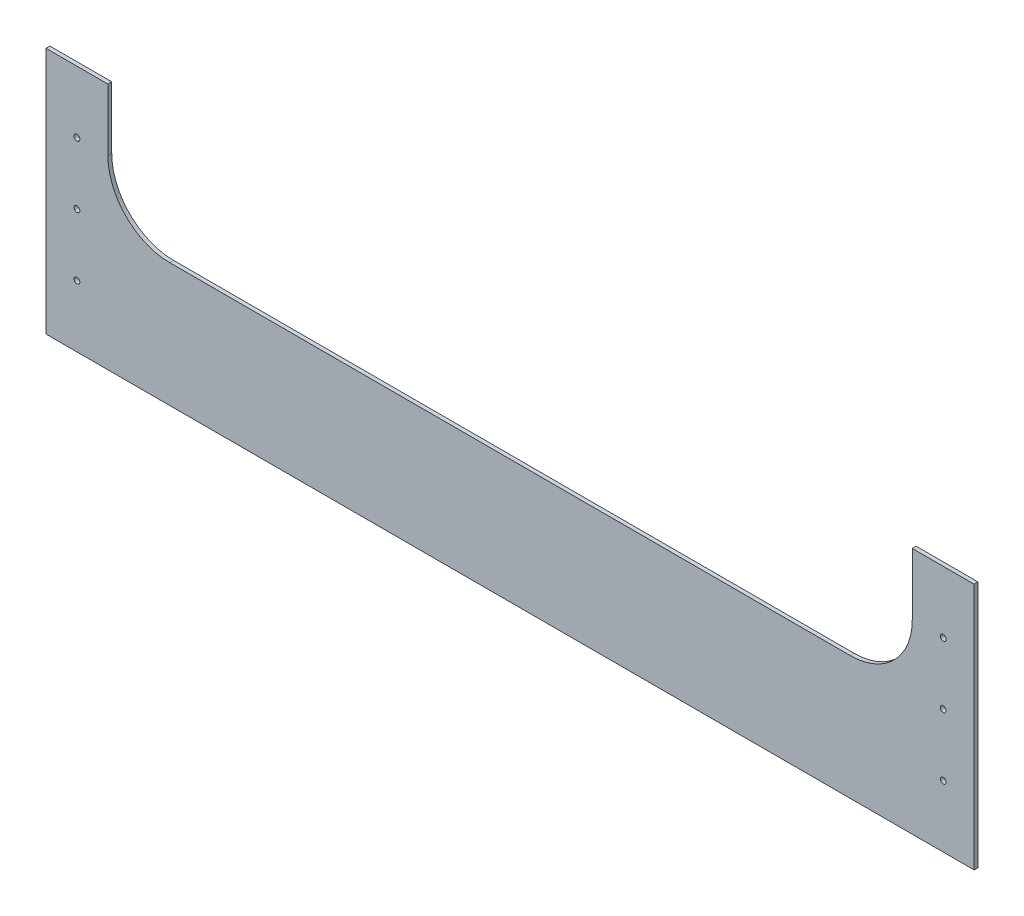
ISO-10303-21;
HEADER;
FILE_DESCRIPTION(('STEP AP214'),'2;1');
FILE_NAME('part.step','',(''),(''),'','','');
FILE_SCHEMA(('AUTOMOTIVE_DESIGN { 1 0 10303 214 1 1 1 1 }'));
ENDSEC;
DATA;
#1=APPLICATION_CONTEXT('core data for automotive mechanical design processes');
#2=APPLICATION_PROTOCOL_DEFINITION('international standard','automotive_design',2000,#1);
#3=PRODUCT_CONTEXT('',#1,'mechanical');
#4=PRODUCT('Part','Part','',(#3));
#5=PRODUCT_RELATED_PRODUCT_CATEGORY('part','',(#4));
#6=PRODUCT_DEFINITION_FORMATION('','',#4);
#7=PRODUCT_DEFINITION_CONTEXT('part definition',#1,'design');
#8=PRODUCT_DEFINITION('design','',#6,#7);
#9=PRODUCT_DEFINITION_SHAPE('','',#8);
#10=(LENGTH_UNIT() NAMED_UNIT(*) SI_UNIT(.MILLI.,.METRE.));
#11=(NAMED_UNIT(*) PLANE_ANGLE_UNIT() SI_UNIT($,.RADIAN.));
#12=(NAMED_UNIT(*) SI_UNIT($,.STERADIAN.) SOLID_ANGLE_UNIT());
#13=UNCERTAINTY_MEASURE_WITH_UNIT(LENGTH_MEASURE(1.E-05),#10,'distance_accuracy_value','');
#14=(GEOMETRIC_REPRESENTATION_CONTEXT(3) GLOBAL_UNCERTAINTY_ASSIGNED_CONTEXT((#13)) GLOBAL_UNIT_ASSIGNED_CONTEXT((#10,
#11,#12)) REPRESENTATION_CONTEXT('',''));
#15=CARTESIAN_POINT('',(0.,0.,0.));
#16=DIRECTION('',(0.,0.,1.));
#17=DIRECTION('',(1.,0.,0.));
#18=AXIS2_PLACEMENT_3D('',#15,#16,#17);
#19=CARTESIAN_POINT('',(279.4,152.4,3.175));
#20=DIRECTION('',(0.,0.,-1.));
#21=DIRECTION('',(-1.,0.,0.));
#22=AXIS2_PLACEMENT_3D('',#19,#20,#21);
#23=PLANE('',#22);
#24=DIRECTION('',(0.,1.,0.));
#25=VECTOR('',#24,1.);
#26=CARTESIAN_POINT('',(381.,0.,3.175));
#27=LINE('',#26,#25);
#28=CARTESIAN_POINT('',(381.,0.,3.175));
#29=VERTEX_POINT('',#28);
#30=CARTESIAN_POINT('',(381.,203.2,3.175));
#31=VERTEX_POINT('',#30);
#32=EDGE_CURVE('E165',#29,#31,#27,.T.);
#33=ORIENTED_EDGE('',*,*,#32,.T.);
#34=DIRECTION('',(-1.,0.,0.));
#35=VECTOR('',#34,1.);
#36=CARTESIAN_POINT('',(381.,203.2,3.175));
#37=LINE('',#36,#35);
#38=CARTESIAN_POINT('',(330.2,203.2,3.175));
#39=VERTEX_POINT('',#38);
#40=EDGE_CURVE('E103',#31,#39,#37,.T.);
#41=ORIENTED_EDGE('',*,*,#40,.T.);
#42=DIRECTION('',(0.,-1.,0.));
#43=VECTOR('',#42,1.);
#44=CARTESIAN_POINT('',(330.2,203.2,3.175));
#45=LINE('',#44,#43);
#46=CARTESIAN_POINT('',(330.2,152.4,3.175));
#47=VERTEX_POINT('',#46);
#48=EDGE_CURVE('E186',#39,#47,#45,.T.);
#49=ORIENTED_EDGE('',*,*,#48,.T.);
#50=CARTESIAN_POINT('',(279.4,152.4,3.175));
#51=DIRECTION('',(0.,0.,-1.));
#52=DIRECTION('',(-1.,0.,0.));
#53=AXIS2_PLACEMENT_3D('',#50,#51,#52);
#54=CIRCLE('',#53,50.8);
#55=CARTESIAN_POINT('',(279.4,101.6,3.175));
#56=VERTEX_POINT('',#55);
#57=EDGE_CURVE('E205',#47,#56,#54,.T.);
#58=ORIENTED_EDGE('',*,*,#57,.T.);
#59=DIRECTION('',(-1.,0.,0.));
#60=VECTOR('',#59,1.);
#61=CARTESIAN_POINT('',(279.4,101.6,3.175));
#62=LINE('',#61,#60);
#63=CARTESIAN_POINT('',(-279.4,101.6,3.175));
#64=VERTEX_POINT('',#63);
#65=EDGE_CURVE('E202',#56,#64,#62,.T.);
#66=ORIENTED_EDGE('',*,*,#65,.T.);
#67=CARTESIAN_POINT('',(-279.4,152.4,3.175));
#68=DIRECTION('',(0.,0.,-1.));
#69=DIRECTION('',(-1.,0.,0.));
#70=AXIS2_PLACEMENT_3D('',#67,#68,#69);
#71=CIRCLE('',#70,50.8);
#72=CARTESIAN_POINT('',(-330.2,152.4,3.175));
#73=VERTEX_POINT('',#72);
#74=EDGE_CURVE('E204',#64,#73,#71,.T.);
#75=ORIENTED_EDGE('',*,*,#74,.T.);
#76=DIRECTION('',(0.,1.,0.));
#77=VECTOR('',#76,1.);
#78=CARTESIAN_POINT('',(-330.2,152.4,3.175));
#79=LINE('',#78,#77);
#80=CARTESIAN_POINT('',(-330.2,203.2,3.175));
#81=VERTEX_POINT('',#80);
#82=EDGE_CURVE('E128',#73,#81,#79,.T.);
#83=ORIENTED_EDGE('',*,*,#82,.T.);
#84=DIRECTION('',(-1.,0.,0.));
#85=VECTOR('',#84,1.);
#86=CARTESIAN_POINT('',(-330.2,203.2,3.175));
#87=LINE('',#86,#85);
#88=CARTESIAN_POINT('',(-381.,203.2,3.175));
#89=VERTEX_POINT('',#88);
#90=EDGE_CURVE('E122',#81,#89,#87,.T.);
#91=ORIENTED_EDGE('',*,*,#90,.T.);
#92=DIRECTION('',(0.,-1.,0.));
#93=VECTOR('',#92,1.);
#94=CARTESIAN_POINT('',(-381.,203.2,3.175));
#95=LINE('',#94,#93);
#96=CARTESIAN_POINT('',(-381.,0.,3.175));
#97=VERTEX_POINT('',#96);
#98=EDGE_CURVE('E126',#89,#97,#95,.T.);
#99=ORIENTED_EDGE('',*,*,#98,.T.);
#100=DIRECTION('',(1.,0.,0.));
#101=VECTOR('',#100,1.);
#102=CARTESIAN_POINT('',(-381.,0.,3.175));
#103=LINE('',#102,#101);
#104=EDGE_CURVE('E54',#97,#29,#103,.T.);
#105=ORIENTED_EDGE('',*,*,#104,.T.);
#106=EDGE_LOOP('',(#33,#41,#49,#58,#66,#75,#83,#91,#99,#105));
#107=FACE_BOUND('',#106,.T.);
#108=CARTESIAN_POINT('',(-355.6,152.4,3.175));
#109=DIRECTION('',(0.,0.,1.));
#110=DIRECTION('',(1.,0.,0.));
#111=AXIS2_PLACEMENT_3D('',#108,#109,#110);
#112=CIRCLE('',#111,2.38125);
#113=CARTESIAN_POINT('',(-353.21875,152.4,3.175));
#114=VERTEX_POINT('',#113);
#115=EDGE_CURVE('E150',#114,#114,#112,.T.);
#116=ORIENTED_EDGE('',*,*,#115,.F.);
#117=EDGE_LOOP('',(#116));
#118=FACE_BOUND('',#117,.T.);
#119=CARTESIAN_POINT('',(355.6,152.4,3.175));
#120=DIRECTION('',(0.,0.,1.));
#121=DIRECTION('',(1.,0.,0.));
#122=AXIS2_PLACEMENT_3D('',#119,#120,#121);
#123=CIRCLE('',#122,2.38125);
#124=CARTESIAN_POINT('',(357.98125,152.4,3.175));
#125=VERTEX_POINT('',#124);
#126=EDGE_CURVE('E216',#125,#125,#123,.T.);
#127=ORIENTED_EDGE('',*,*,#126,.F.);
#128=EDGE_LOOP('',(#127));
#129=FACE_BOUND('',#128,.T.);
#130=CARTESIAN_POINT('',(355.6,101.6,3.175));
#131=DIRECTION('',(0.,0.,1.));
#132=DIRECTION('',(1.,0.,0.));
#133=AXIS2_PLACEMENT_3D('',#130,#131,#132);
#134=CIRCLE('',#133,2.38125);
#135=CARTESIAN_POINT('',(357.98125,101.6,3.175));
#136=VERTEX_POINT('',#135);
#137=EDGE_CURVE('E222',#136,#136,#134,.T.);
#138=ORIENTED_EDGE('',*,*,#137,.F.);
#139=EDGE_LOOP('',(#138));
#140=FACE_BOUND('',#139,.T.);
#141=CARTESIAN_POINT('',(355.6,50.8,3.175));
#142=DIRECTION('',(0.,0.,1.));
#143=DIRECTION('',(1.,0.,0.));
#144=AXIS2_PLACEMENT_3D('',#141,#142,#143);
#145=CIRCLE('',#144,2.38125);
#146=CARTESIAN_POINT('',(357.98125,50.8,3.175));
#147=VERTEX_POINT('',#146);
#148=EDGE_CURVE('E228',#147,#147,#145,.T.);
#149=ORIENTED_EDGE('',*,*,#148,.F.);
#150=EDGE_LOOP('',(#149));
#151=FACE_BOUND('',#150,.T.);
#152=CARTESIAN_POINT('',(-355.6,101.6,3.175));
#153=DIRECTION('',(0.,0.,1.));
#154=DIRECTION('',(1.,0.,0.));
#155=AXIS2_PLACEMENT_3D('',#152,#153,#154);
#156=CIRCLE('',#155,2.38125);
#157=CARTESIAN_POINT('',(-353.21875,101.6,3.175));
#158=VERTEX_POINT('',#157);
#159=EDGE_CURVE('E234',#158,#158,#156,.T.);
#160=ORIENTED_EDGE('',*,*,#159,.F.);
#161=EDGE_LOOP('',(#160));
#162=FACE_BOUND('',#161,.T.);
#163=CARTESIAN_POINT('',(-355.6,50.8,3.175));
#164=DIRECTION('',(0.,0.,1.));
#165=DIRECTION('',(1.,0.,0.));
#166=AXIS2_PLACEMENT_3D('',#163,#164,#165);
#167=CIRCLE('',#166,2.38125);
#168=CARTESIAN_POINT('',(-353.21875,50.8,3.175));
#169=VERTEX_POINT('',#168);
#170=EDGE_CURVE('E240',#169,#169,#167,.T.);
#171=ORIENTED_EDGE('',*,*,#170,.F.);
#172=EDGE_LOOP('',(#171));
#173=FACE_BOUND('',#172,.T.);
#174=ADVANCED_FACE('F37',(#107,#118,#129,#140,#151,#162,#173),#23,.F.);
#175=CARTESIAN_POINT('',(279.4,152.4,0.));
#176=DIRECTION('',(0.,0.,-1.));
#177=DIRECTION('',(-1.,0.,0.));
#178=AXIS2_PLACEMENT_3D('',#175,#176,#177);
#179=PLANE('',#178);
#180=CARTESIAN_POINT('',(-355.6,101.6,0.));
#181=DIRECTION('',(0.,0.,1.));
#182=DIRECTION('',(1.,0.,0.));
#183=AXIS2_PLACEMENT_3D('',#180,#181,#182);
#184=CIRCLE('',#183,2.38125);
#185=CARTESIAN_POINT('',(-353.21875,101.6,0.));
#186=VERTEX_POINT('',#185);
#187=EDGE_CURVE('E237',#186,#186,#184,.T.);
#188=ORIENTED_EDGE('',*,*,#187,.T.);
#189=EDGE_LOOP('',(#188));
#190=FACE_BOUND('',#189,.T.);
#191=CARTESIAN_POINT('',(355.6,101.6,0.));
#192=DIRECTION('',(0.,0.,1.));
#193=DIRECTION('',(1.,0.,0.));
#194=AXIS2_PLACEMENT_3D('',#191,#192,#193);
#195=CIRCLE('',#194,2.38125);
#196=CARTESIAN_POINT('',(357.98125,101.6,0.));
#197=VERTEX_POINT('',#196);
#198=EDGE_CURVE('E225',#197,#197,#195,.T.);
#199=ORIENTED_EDGE('',*,*,#198,.T.);
#200=EDGE_LOOP('',(#199));
#201=FACE_BOUND('',#200,.T.);
#202=CARTESIAN_POINT('',(-355.6,152.4,0.));
#203=DIRECTION('',(0.,0.,1.));
#204=DIRECTION('',(1.,0.,0.));
#205=AXIS2_PLACEMENT_3D('',#202,#203,#204);
#206=CIRCLE('',#205,2.38125);
#207=CARTESIAN_POINT('',(-353.21875,152.4,0.));
#208=VERTEX_POINT('',#207);
#209=EDGE_CURVE('E213',#208,#208,#206,.T.);
#210=ORIENTED_EDGE('',*,*,#209,.T.);
#211=EDGE_LOOP('',(#210));
#212=FACE_BOUND('',#211,.T.);
#213=DIRECTION('',(0.,1.,0.));
#214=VECTOR('',#213,1.);
#215=CARTESIAN_POINT('',(381.,0.,0.));
#216=LINE('',#215,#214);
#217=CARTESIAN_POINT('',(381.,0.,0.));
#218=VERTEX_POINT('',#217);
#219=CARTESIAN_POINT('',(381.,203.2,0.));
#220=VERTEX_POINT('',#219);
#221=EDGE_CURVE('E146',#218,#220,#216,.T.);
#222=ORIENTED_EDGE('',*,*,#221,.F.);
#223=DIRECTION('',(1.,0.,0.));
#224=VECTOR('',#223,1.);
#225=CARTESIAN_POINT('',(-381.,0.,0.));
#226=LINE('',#225,#224);
#227=CARTESIAN_POINT('',(-381.,0.,0.));
#228=VERTEX_POINT('',#227);
#229=EDGE_CURVE('E95',#228,#218,#226,.T.);
#230=ORIENTED_EDGE('',*,*,#229,.F.);
#231=DIRECTION('',(0.,-1.,0.));
#232=VECTOR('',#231,1.);
#233=CARTESIAN_POINT('',(-381.,203.2,0.));
#234=LINE('',#233,#232);
#235=CARTESIAN_POINT('',(-381.,203.2,0.));
#236=VERTEX_POINT('',#235);
#237=EDGE_CURVE('E89',#236,#228,#234,.T.);
#238=ORIENTED_EDGE('',*,*,#237,.F.);
#239=DIRECTION('',(-1.,0.,0.));
#240=VECTOR('',#239,1.);
#241=CARTESIAN_POINT('',(-330.2,203.2,0.));
#242=LINE('',#241,#240);
#243=CARTESIAN_POINT('',(-330.2,203.2,0.));
#244=VERTEX_POINT('',#243);
#245=EDGE_CURVE('E136',#244,#236,#242,.T.);
#246=ORIENTED_EDGE('',*,*,#245,.F.);
#247=DIRECTION('',(0.,1.,0.));
#248=VECTOR('',#247,1.);
#249=CARTESIAN_POINT('',(-330.2,152.4,0.));
#250=LINE('',#249,#248);
#251=CARTESIAN_POINT('',(-330.2,152.4,0.));
#252=VERTEX_POINT('',#251);
#253=EDGE_CURVE('E160',#252,#244,#250,.T.);
#254=ORIENTED_EDGE('',*,*,#253,.F.);
#255=CARTESIAN_POINT('',(-279.4,152.4,0.));
#256=DIRECTION('',(0.,0.,-1.));
#257=DIRECTION('',(-1.,0.,0.));
#258=AXIS2_PLACEMENT_3D('',#255,#256,#257);
#259=CIRCLE('',#258,50.8);
#260=CARTESIAN_POINT('',(-279.4,101.6,0.));
#261=VERTEX_POINT('',#260);
#262=EDGE_CURVE('E158',#261,#252,#259,.T.);
#263=ORIENTED_EDGE('',*,*,#262,.F.);
#264=DIRECTION('',(-1.,0.,0.));
#265=VECTOR('',#264,1.);
#266=CARTESIAN_POINT('',(279.4,101.6,0.));
#267=LINE('',#266,#265);
#268=CARTESIAN_POINT('',(279.4,101.6,0.));
#269=VERTEX_POINT('',#268);
#270=EDGE_CURVE('E156',#269,#261,#267,.T.);
#271=ORIENTED_EDGE('',*,*,#270,.F.);
#272=CARTESIAN_POINT('',(279.4,152.4,0.));
#273=DIRECTION('',(0.,0.,-1.));
#274=DIRECTION('',(-1.,0.,0.));
#275=AXIS2_PLACEMENT_3D('',#272,#273,#274);
#276=CIRCLE('',#275,50.8);
#277=CARTESIAN_POINT('',(330.2,152.4,0.));
#278=VERTEX_POINT('',#277);
#279=EDGE_CURVE('E154',#278,#269,#276,.T.);
#280=ORIENTED_EDGE('',*,*,#279,.F.);
#281=DIRECTION('',(0.,-1.,0.));
#282=VECTOR('',#281,1.);
#283=CARTESIAN_POINT('',(330.2,203.2,0.));
#284=LINE('',#283,#282);
#285=CARTESIAN_POINT('',(330.2,203.2,0.));
#286=VERTEX_POINT('',#285);
#287=EDGE_CURVE('E152',#286,#278,#284,.T.);
#288=ORIENTED_EDGE('',*,*,#287,.F.);
#289=DIRECTION('',(-1.,0.,0.));
#290=VECTOR('',#289,1.);
#291=CARTESIAN_POINT('',(381.,203.2,0.));
#292=LINE('',#291,#290);
#293=EDGE_CURVE('E149',#220,#286,#292,.T.);
#294=ORIENTED_EDGE('',*,*,#293,.F.);
#295=EDGE_LOOP('',(#222,#230,#238,#246,#254,#263,#271,#280,#288,#294));
#296=FACE_BOUND('',#295,.T.);
#297=CARTESIAN_POINT('',(355.6,152.4,0.));
#298=DIRECTION('',(0.,0.,1.));
#299=DIRECTION('',(1.,0.,0.));
#300=AXIS2_PLACEMENT_3D('',#297,#298,#299);
#301=CIRCLE('',#300,2.38125);
#302=CARTESIAN_POINT('',(357.98125,152.4,0.));
#303=VERTEX_POINT('',#302);
#304=EDGE_CURVE('E219',#303,#303,#301,.T.);
#305=ORIENTED_EDGE('',*,*,#304,.T.);
#306=EDGE_LOOP('',(#305));
#307=FACE_BOUND('',#306,.T.);
#308=CARTESIAN_POINT('',(355.6,50.8,0.));
#309=DIRECTION('',(0.,0.,1.));
#310=DIRECTION('',(1.,0.,0.));
#311=AXIS2_PLACEMENT_3D('',#308,#309,#310);
#312=CIRCLE('',#311,2.38125);
#313=CARTESIAN_POINT('',(357.98125,50.8,0.));
#314=VERTEX_POINT('',#313);
#315=EDGE_CURVE('E231',#314,#314,#312,.T.);
#316=ORIENTED_EDGE('',*,*,#315,.T.);
#317=EDGE_LOOP('',(#316));
#318=FACE_BOUND('',#317,.T.);
#319=CARTESIAN_POINT('',(-355.6,50.8,0.));
#320=DIRECTION('',(0.,0.,1.));
#321=DIRECTION('',(1.,0.,0.));
#322=AXIS2_PLACEMENT_3D('',#319,#320,#321);
#323=CIRCLE('',#322,2.38125);
#324=CARTESIAN_POINT('',(-353.21875,50.8,0.));
#325=VERTEX_POINT('',#324);
#326=EDGE_CURVE('E243',#325,#325,#323,.T.);
#327=ORIENTED_EDGE('',*,*,#326,.T.);
#328=EDGE_LOOP('',(#327));
#329=FACE_BOUND('',#328,.T.);
#330=ADVANCED_FACE('F190',(#190,#201,#212,#296,#307,#318,#329),#179,.T.);
#331=CARTESIAN_POINT('',(381.,0.,3.175));
#332=DIRECTION('',(-1.,0.,0.));
#333=DIRECTION('',(0.,0.,1.));
#334=AXIS2_PLACEMENT_3D('',#331,#332,#333);
#335=PLANE('',#334);
#336=ORIENTED_EDGE('',*,*,#221,.T.);
#337=DIRECTION('',(0.,0.,-1.));
#338=VECTOR('',#337,1.);
#339=CARTESIAN_POINT('',(381.,203.2,3.175));
#340=LINE('',#339,#338);
#341=EDGE_CURVE('E11',#31,#220,#340,.T.);
#342=ORIENTED_EDGE('',*,*,#341,.F.);
#343=ORIENTED_EDGE('',*,*,#32,.F.);
#344=DIRECTION('',(0.,0.,-1.));
#345=VECTOR('',#344,1.);
#346=CARTESIAN_POINT('',(381.,0.,3.175));
#347=LINE('',#346,#345);
#348=EDGE_CURVE('E142',#29,#218,#347,.T.);
#349=ORIENTED_EDGE('',*,*,#348,.T.);
#350=EDGE_LOOP('',(#336,#342,#343,#349));
#351=FACE_BOUND('',#350,.T.);
#352=ADVANCED_FACE('F39',(#351),#335,.F.);
#353=CARTESIAN_POINT('',(381.,203.2,3.175));
#354=DIRECTION('',(0.,-1.,0.));
#355=DIRECTION('',(0.,0.,-1.));
#356=AXIS2_PLACEMENT_3D('',#353,#354,#355);
#357=PLANE('',#356);
#358=ORIENTED_EDGE('',*,*,#293,.T.);
#359=DIRECTION('',(0.,0.,-1.));
#360=VECTOR('',#359,1.);
#361=CARTESIAN_POINT('',(330.2,203.2,3.175));
#362=LINE('',#361,#360);
#363=EDGE_CURVE('E46',#39,#286,#362,.T.);
#364=ORIENTED_EDGE('',*,*,#363,.F.);
#365=ORIENTED_EDGE('',*,*,#40,.F.);
#366=ORIENTED_EDGE('',*,*,#341,.T.);
#367=EDGE_LOOP('',(#358,#364,#365,#366));
#368=FACE_BOUND('',#367,.T.);
#369=ADVANCED_FACE('F283',(#368),#357,.F.);
#370=CARTESIAN_POINT('',(330.2,203.2,3.175));
#371=DIRECTION('',(1.,0.,0.));
#372=DIRECTION('',(0.,0.,-1.));
#373=AXIS2_PLACEMENT_3D('',#370,#371,#372);
#374=PLANE('',#373);
#375=ORIENTED_EDGE('',*,*,#287,.T.);
#376=DIRECTION('',(0.,0.,-1.));
#377=VECTOR('',#376,1.);
#378=CARTESIAN_POINT('',(330.2,152.4,3.175));
#379=LINE('',#378,#377);
#380=EDGE_CURVE('E178',#47,#278,#379,.T.);
#381=ORIENTED_EDGE('',*,*,#380,.F.);
#382=ORIENTED_EDGE('',*,*,#48,.F.);
#383=ORIENTED_EDGE('',*,*,#363,.T.);
#384=EDGE_LOOP('',(#375,#381,#382,#383));
#385=FACE_BOUND('',#384,.T.);
#386=ADVANCED_FACE('F184',(#385),#374,.F.);
#387=CARTESIAN_POINT('',(279.4,152.4,3.175));
#388=DIRECTION('',(0.,0.,-1.));
#389=DIRECTION('',(-1.,0.,0.));
#390=AXIS2_PLACEMENT_3D('',#387,#388,#389);
#391=CYLINDRICAL_SURFACE('',#390,50.8);
#392=ORIENTED_EDGE('',*,*,#279,.T.);
#393=DIRECTION('',(0.,0.,-1.));
#394=VECTOR('',#393,1.);
#395=CARTESIAN_POINT('',(279.4,101.6,3.175));
#396=LINE('',#395,#394);
#397=EDGE_CURVE('E175',#56,#269,#396,.T.);
#398=ORIENTED_EDGE('',*,*,#397,.F.);
#399=ORIENTED_EDGE('',*,*,#57,.F.);
#400=ORIENTED_EDGE('',*,*,#380,.T.);
#401=EDGE_LOOP('',(#392,#398,#399,#400));
#402=FACE_BOUND('',#401,.T.);
#403=ADVANCED_FACE('F196',(#402),#391,.F.);
#404=CARTESIAN_POINT('',(279.4,101.6,3.175));
#405=DIRECTION('',(0.,-1.,0.));
#406=DIRECTION('',(0.,0.,-1.));
#407=AXIS2_PLACEMENT_3D('',#404,#405,#406);
#408=PLANE('',#407);
#409=ORIENTED_EDGE('',*,*,#270,.T.);
#410=DIRECTION('',(0.,0.,-1.));
#411=VECTOR('',#410,1.);
#412=CARTESIAN_POINT('',(-279.4,101.6,3.175));
#413=LINE('',#412,#411);
#414=EDGE_CURVE('E172',#64,#261,#413,.T.);
#415=ORIENTED_EDGE('',*,*,#414,.F.);
#416=ORIENTED_EDGE('',*,*,#65,.F.);
#417=ORIENTED_EDGE('',*,*,#397,.T.);
#418=EDGE_LOOP('',(#409,#415,#416,#417));
#419=FACE_BOUND('',#418,.T.);
#420=ADVANCED_FACE('F200',(#419),#408,.F.);
#421=CARTESIAN_POINT('',(-279.4,152.4,3.175));
#422=DIRECTION('',(0.,0.,-1.));
#423=DIRECTION('',(-1.,0.,0.));
#424=AXIS2_PLACEMENT_3D('',#421,#422,#423);
#425=CYLINDRICAL_SURFACE('',#424,50.8);
#426=ORIENTED_EDGE('',*,*,#262,.T.);
#427=DIRECTION('',(0.,0.,-1.));
#428=VECTOR('',#427,1.);
#429=CARTESIAN_POINT('',(-330.2,152.4,3.175));
#430=LINE('',#429,#428);
#431=EDGE_CURVE('E169',#73,#252,#430,.T.);
#432=ORIENTED_EDGE('',*,*,#431,.F.);
#433=ORIENTED_EDGE('',*,*,#74,.F.);
#434=ORIENTED_EDGE('',*,*,#414,.T.);
#435=EDGE_LOOP('',(#426,#432,#433,#434));
#436=FACE_BOUND('',#435,.T.);
#437=ADVANCED_FACE('F273',(#436),#425,.F.);
#438=CARTESIAN_POINT('',(-330.2,152.4,3.175));
#439=DIRECTION('',(-1.,0.,0.));
#440=DIRECTION('',(0.,0.,1.));
#441=AXIS2_PLACEMENT_3D('',#438,#439,#440);
#442=PLANE('',#441);
#443=ORIENTED_EDGE('',*,*,#253,.T.);
#444=DIRECTION('',(0.,0.,-1.));
#445=VECTOR('',#444,1.);
#446=CARTESIAN_POINT('',(-330.2,203.2,3.175));
#447=LINE('',#446,#445);
#448=EDGE_CURVE('E137',#81,#244,#447,.T.);
#449=ORIENTED_EDGE('',*,*,#448,.F.);
#450=ORIENTED_EDGE('',*,*,#82,.F.);
#451=ORIENTED_EDGE('',*,*,#431,.T.);
#452=EDGE_LOOP('',(#443,#449,#450,#451));
#453=FACE_BOUND('',#452,.T.);
#454=ADVANCED_FACE('F270',(#453),#442,.F.);
#455=CARTESIAN_POINT('',(-330.2,203.2,3.175));
#456=DIRECTION('',(0.,-1.,0.));
#457=DIRECTION('',(0.,0.,-1.));
#458=AXIS2_PLACEMENT_3D('',#455,#456,#457);
#459=PLANE('',#458);
#460=ORIENTED_EDGE('',*,*,#245,.T.);
#461=DIRECTION('',(0.,0.,-1.));
#462=VECTOR('',#461,1.);
#463=CARTESIAN_POINT('',(-381.,203.2,3.175));
#464=LINE('',#463,#462);
#465=EDGE_CURVE('E133',#89,#236,#464,.T.);
#466=ORIENTED_EDGE('',*,*,#465,.F.);
#467=ORIENTED_EDGE('',*,*,#90,.F.);
#468=ORIENTED_EDGE('',*,*,#448,.T.);
#469=EDGE_LOOP('',(#460,#466,#467,#468));
#470=FACE_BOUND('',#469,.T.);
#471=ADVANCED_FACE('F134',(#470),#459,.F.);
#472=CARTESIAN_POINT('',(-381.,203.2,3.175));
#473=DIRECTION('',(1.,0.,0.));
#474=DIRECTION('',(0.,0.,-1.));
#475=AXIS2_PLACEMENT_3D('',#472,#473,#474);
#476=PLANE('',#475);
#477=ORIENTED_EDGE('',*,*,#237,.T.);
#478=DIRECTION('',(0.,0.,-1.));
#479=VECTOR('',#478,1.);
#480=CARTESIAN_POINT('',(-381.,0.,3.175));
#481=LINE('',#480,#479);
#482=EDGE_CURVE('E138',#97,#228,#481,.T.);
#483=ORIENTED_EDGE('',*,*,#482,.F.);
#484=ORIENTED_EDGE('',*,*,#98,.F.);
#485=ORIENTED_EDGE('',*,*,#465,.T.);
#486=EDGE_LOOP('',(#477,#483,#484,#485));
#487=FACE_BOUND('',#486,.T.);
#488=ADVANCED_FACE('F140',(#487),#476,.F.);
#489=CARTESIAN_POINT('',(-381.,0.,3.175));
#490=DIRECTION('',(0.,1.,0.));
#491=DIRECTION('',(0.,0.,1.));
#492=AXIS2_PLACEMENT_3D('',#489,#490,#491);
#493=PLANE('',#492);
#494=ORIENTED_EDGE('',*,*,#229,.T.);
#495=ORIENTED_EDGE('',*,*,#348,.F.);
#496=ORIENTED_EDGE('',*,*,#104,.F.);
#497=ORIENTED_EDGE('',*,*,#482,.T.);
#498=EDGE_LOOP('',(#494,#495,#496,#497));
#499=FACE_BOUND('',#498,.T.);
#500=ADVANCED_FACE('F263',(#499),#493,.F.);
#501=CARTESIAN_POINT('',(-355.6,152.4,3.175));
#502=DIRECTION('',(0.,0.,-1.));
#503=DIRECTION('',(-1.,0.,0.));
#504=AXIS2_PLACEMENT_3D('',#501,#502,#503);
#505=CYLINDRICAL_SURFACE('',#504,2.38125);
#506=ORIENTED_EDGE('',*,*,#115,.T.);
#507=EDGE_LOOP('',(#506));
#508=FACE_BOUND('',#507,.T.);
#509=ORIENTED_EDGE('',*,*,#209,.F.);
#510=EDGE_LOOP('',(#509));
#511=FACE_BOUND('',#510,.T.);
#512=ADVANCED_FACE('F260',(#508,#511),#505,.F.);
#513=CARTESIAN_POINT('',(355.6,152.4,3.175));
#514=DIRECTION('',(0.,0.,-1.));
#515=DIRECTION('',(-1.,0.,0.));
#516=AXIS2_PLACEMENT_3D('',#513,#514,#515);
#517=CYLINDRICAL_SURFACE('',#516,2.38125);
#518=ORIENTED_EDGE('',*,*,#126,.T.);
#519=EDGE_LOOP('',(#518));
#520=FACE_BOUND('',#519,.T.);
#521=ORIENTED_EDGE('',*,*,#304,.F.);
#522=EDGE_LOOP('',(#521));
#523=FACE_BOUND('',#522,.T.);
#524=ADVANCED_FACE('F373',(#520,#523),#517,.F.);
#525=CARTESIAN_POINT('',(355.6,101.6,3.175));
#526=DIRECTION('',(0.,0.,-1.));
#527=DIRECTION('',(-1.,0.,0.));
#528=AXIS2_PLACEMENT_3D('',#525,#526,#527);
#529=CYLINDRICAL_SURFACE('',#528,2.38125);
#530=ORIENTED_EDGE('',*,*,#137,.T.);
#531=EDGE_LOOP('',(#530));
#532=FACE_BOUND('',#531,.T.);
#533=ORIENTED_EDGE('',*,*,#198,.F.);
#534=EDGE_LOOP('',(#533));
#535=FACE_BOUND('',#534,.T.);
#536=ADVANCED_FACE('F382',(#532,#535),#529,.F.);
#537=CARTESIAN_POINT('',(355.6,50.8,3.175));
#538=DIRECTION('',(0.,0.,-1.));
#539=DIRECTION('',(-1.,0.,0.));
#540=AXIS2_PLACEMENT_3D('',#537,#538,#539);
#541=CYLINDRICAL_SURFACE('',#540,2.38125);
#542=ORIENTED_EDGE('',*,*,#148,.T.);
#543=EDGE_LOOP('',(#542));
#544=FACE_BOUND('',#543,.T.);
#545=ORIENTED_EDGE('',*,*,#315,.F.);
#546=EDGE_LOOP('',(#545));
#547=FACE_BOUND('',#546,.T.);
#548=ADVANCED_FACE('F391',(#544,#547),#541,.F.);
#549=CARTESIAN_POINT('',(-355.6,101.6,3.175));
#550=DIRECTION('',(0.,0.,-1.));
#551=DIRECTION('',(-1.,0.,0.));
#552=AXIS2_PLACEMENT_3D('',#549,#550,#551);
#553=CYLINDRICAL_SURFACE('',#552,2.38125);
#554=ORIENTED_EDGE('',*,*,#159,.T.);
#555=EDGE_LOOP('',(#554));
#556=FACE_BOUND('',#555,.T.);
#557=ORIENTED_EDGE('',*,*,#187,.F.);
#558=EDGE_LOOP('',(#557));
#559=FACE_BOUND('',#558,.T.);
#560=ADVANCED_FACE('F401',(#556,#559),#553,.F.);
#561=CARTESIAN_POINT('',(-355.6,50.8,3.175));
#562=DIRECTION('',(0.,0.,-1.));
#563=DIRECTION('',(-1.,0.,0.));
#564=AXIS2_PLACEMENT_3D('',#561,#562,#563);
#565=CYLINDRICAL_SURFACE('',#564,2.38125);
#566=ORIENTED_EDGE('',*,*,#170,.T.);
#567=EDGE_LOOP('',(#566));
#568=FACE_BOUND('',#567,.T.);
#569=ORIENTED_EDGE('',*,*,#326,.F.);
#570=EDGE_LOOP('',(#569));
#571=FACE_BOUND('',#570,.T.);
#572=ADVANCED_FACE('F249',(#568,#571),#565,.F.);
#573=CLOSED_SHELL('',(#174,#330,#352,#369,#386,#403,#420,#437,#454,#471,#488,#500,#512,#524,
#536,#548,#560,#572));
#574=MANIFOLD_SOLID_BREP('B2',#573);
#575=ADVANCED_BREP_SHAPE_REPRESENTATION('',(#18,#574),#14);
#576=SHAPE_DEFINITION_REPRESENTATION(#9,#575);
ENDSEC;
END-ISO-10303-21;
